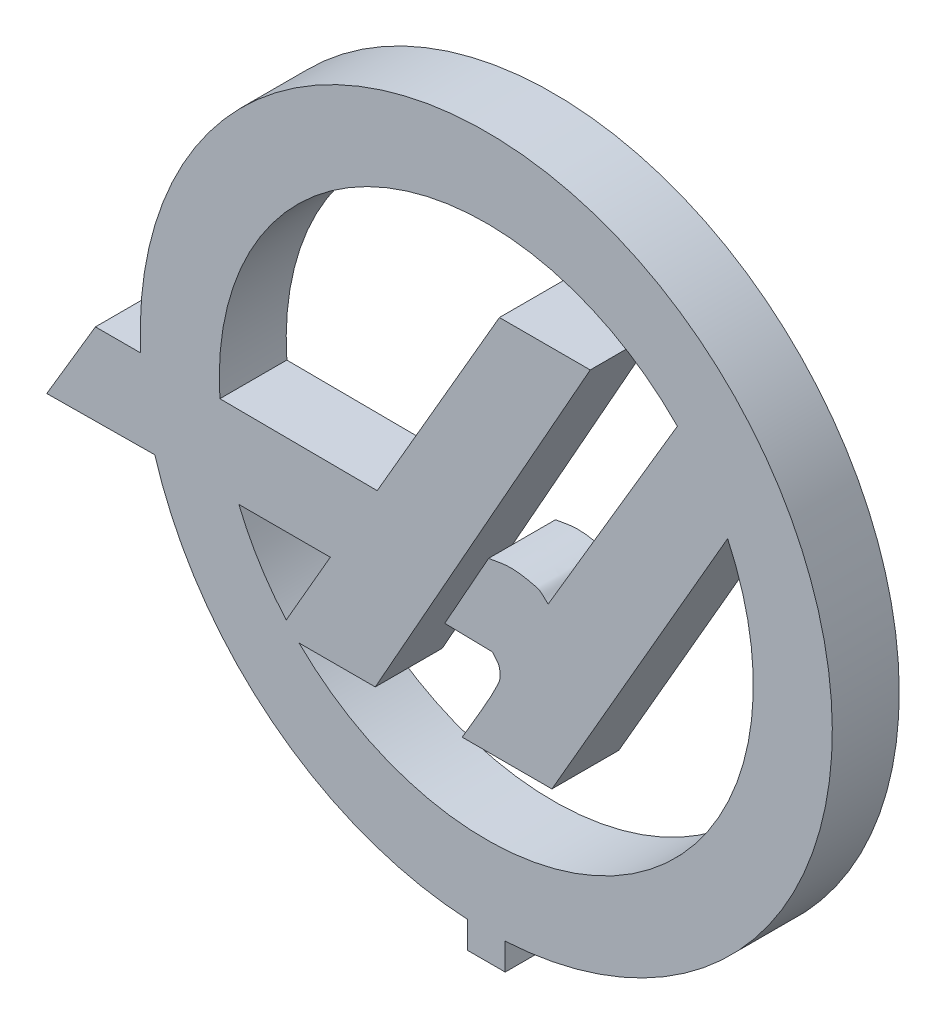
ISO-10303-21;
HEADER;
FILE_DESCRIPTION(('STEP AP214'),'2;1');
FILE_NAME('part.step','',(''),(''),'','','');
FILE_SCHEMA(('AUTOMOTIVE_DESIGN { 1 0 10303 214 1 1 1 1 }'));
ENDSEC;
DATA;
#1=APPLICATION_CONTEXT('core data for automotive mechanical design processes');
#2=APPLICATION_PROTOCOL_DEFINITION('international standard','automotive_design',2000,#1);
#3=PRODUCT_CONTEXT('',#1,'mechanical');
#4=PRODUCT('Part','Part','',(#3));
#5=PRODUCT_RELATED_PRODUCT_CATEGORY('part','',(#4));
#6=PRODUCT_DEFINITION_FORMATION('','',#4);
#7=PRODUCT_DEFINITION_CONTEXT('part definition',#1,'design');
#8=PRODUCT_DEFINITION('design','',#6,#7);
#9=PRODUCT_DEFINITION_SHAPE('','',#8);
#10=(LENGTH_UNIT() NAMED_UNIT(*) SI_UNIT(.MILLI.,.METRE.));
#11=(NAMED_UNIT(*) PLANE_ANGLE_UNIT() SI_UNIT($,.RADIAN.));
#12=(NAMED_UNIT(*) SI_UNIT($,.STERADIAN.) SOLID_ANGLE_UNIT());
#13=UNCERTAINTY_MEASURE_WITH_UNIT(LENGTH_MEASURE(1.E-05),#10,'distance_accuracy_value','');
#14=(GEOMETRIC_REPRESENTATION_CONTEXT(3) GLOBAL_UNCERTAINTY_ASSIGNED_CONTEXT((#13)) GLOBAL_UNIT_ASSIGNED_CONTEXT((#10,
#11,#12)) REPRESENTATION_CONTEXT('',''));
#15=CARTESIAN_POINT('',(0.,0.,0.));
#16=DIRECTION('',(0.,0.,1.));
#17=DIRECTION('',(1.,0.,0.));
#18=AXIS2_PLACEMENT_3D('',#15,#16,#17);
#19=CARTESIAN_POINT('',(429.057617760399,357.949109415741,35.6200474352115));
#20=DIRECTION('',(0.020467844201998,0.999790511734195,0.));
#21=DIRECTION('',(-0.999790511734195,0.020467844201998,0.));
#22=AXIS2_PLACEMENT_3D('',#19,#20,#21);
#23=PLANE('',#22);
#24=DIRECTION('',(0.999790511734195,-0.020467844201998,0.));
#25=VECTOR('',#24,1.);
#26=CARTESIAN_POINT('',(429.057617760399,357.949109415741,32.8800474352115));
#27=LINE('',#26,#25);
#28=CARTESIAN_POINT('',(445.39743278794,357.614598551367,32.8800474352115));
#29=VERTEX_POINT('',#28);
#30=CARTESIAN_POINT('',(447.351308345131,357.574598551342,32.8800474352115));
#31=VERTEX_POINT('',#30);
#32=EDGE_CURVE('E417',#29,#31,#27,.T.);
#33=ORIENTED_EDGE('',*,*,#32,.T.);
#34=DIRECTION('',(0.,0.,-1.));
#35=VECTOR('',#34,1.);
#36=CARTESIAN_POINT('',(447.351308345131,357.574598551342,35.6200474352115));
#37=LINE('',#36,#35);
#38=CARTESIAN_POINT('',(447.351308345131,357.574598551342,35.6200474352115));
#39=VERTEX_POINT('',#38);
#40=EDGE_CURVE('E11',#39,#31,#37,.T.);
#41=ORIENTED_EDGE('',*,*,#40,.F.);
#42=DIRECTION('',(0.999790511734195,-0.020467844201998,0.));
#43=VECTOR('',#42,1.);
#44=CARTESIAN_POINT('',(429.057617760399,357.949109415741,35.6200474352115));
#45=LINE('',#44,#43);
#46=CARTESIAN_POINT('',(445.39743278794,357.614598551367,35.6200474352115));
#47=VERTEX_POINT('',#46);
#48=EDGE_CURVE('E300',#47,#39,#45,.T.);
#49=ORIENTED_EDGE('',*,*,#48,.F.);
#50=DIRECTION('',(0.,0.,-1.));
#51=VECTOR('',#50,1.);
#52=CARTESIAN_POINT('',(445.39743278794,357.614598551367,35.6200474352115));
#53=LINE('',#52,#51);
#54=EDGE_CURVE('E358',#47,#29,#53,.T.);
#55=ORIENTED_EDGE('',*,*,#54,.T.);
#56=EDGE_LOOP('',(#33,#41,#49,#55));
#57=FACE_BOUND('',#56,.T.);
#58=ADVANCED_FACE('F35',(#57),#23,.F.);
#59=CARTESIAN_POINT('',(447.351308345131,357.574598551342,35.6200474352115));
#60=CARTESIAN_POINT('',(447.444641678464,357.441265218008,35.6200474352115));
#61=CARTESIAN_POINT('',(447.593325946149,357.332858547097,35.6200474352115));
#62=CARTESIAN_POINT('',(447.63130834513,357.174598551342,35.6200474352115));
#63=CARTESIAN_POINT('',(447.678086541947,356.979689397938,35.6200474352115));
#64=CARTESIAN_POINT('',(447.676440942673,356.756065403999,35.6200474352115));
#65=CARTESIAN_POINT('',(447.591308345131,356.574598551342,35.6200474352115));
#66=CARTESIAN_POINT('',(447.162829474532,355.661262011381,35.6200474352115));
#67=CARTESIAN_POINT('',(446.604641678464,354.814598551342,35.6200474352115));
#68=CARTESIAN_POINT('',(446.11130834513,353.934598551342,35.6200474352115));
#69=B_SPLINE_CURVE_WITH_KNOTS('',3,(#59,#60,#61,#62,#63,#64,#65,#66,#67,#68),.UNSPECIFIED.,.F.,
.F.,(4,3,3,4),(0.,1.,2.,3.),.UNSPECIFIED.);
#70=DIRECTION('',(0.,0.,-1.));
#71=VECTOR('',#70,1.);
#72=SURFACE_OF_LINEAR_EXTRUSION('',#69,#71);
#73=CARTESIAN_POINT('',(447.351308345131,357.574598551342,32.8800474352115));
#74=CARTESIAN_POINT('',(447.444641678464,357.441265218008,32.8800474352115));
#75=CARTESIAN_POINT('',(447.593325946149,357.332858547097,32.8800474352115));
#76=CARTESIAN_POINT('',(447.63130834513,357.174598551342,32.8800474352115));
#77=CARTESIAN_POINT('',(447.678086541947,356.979689397938,32.8800474352115));
#78=CARTESIAN_POINT('',(447.676440942673,356.756065403999,32.8800474352115));
#79=CARTESIAN_POINT('',(447.591308345131,356.574598551342,32.8800474352115));
#80=CARTESIAN_POINT('',(447.162829474532,355.661262011381,32.8800474352115));
#81=CARTESIAN_POINT('',(446.604641678464,354.814598551342,32.8800474352115));
#82=CARTESIAN_POINT('',(446.11130834513,353.934598551342,32.8800474352115));
#83=B_SPLINE_CURVE_WITH_KNOTS('',3,(#73,#74,#75,#76,#77,#78,#79,#80,#81,#82),.UNSPECIFIED.,.F.,
.F.,(4,3,3,4),(0.,1.,2.,3.),.UNSPECIFIED.);
#84=CARTESIAN_POINT('',(446.11130834513,353.934598551342,32.8800474352115));
#85=VERTEX_POINT('',#84);
#86=EDGE_CURVE('E420',#31,#85,#83,.T.);
#87=ORIENTED_EDGE('',*,*,#86,.T.);
#88=DIRECTION('',(0.,0.,-1.));
#89=VECTOR('',#88,1.);
#90=CARTESIAN_POINT('',(446.11130834513,353.934598551342,35.6200474352115));
#91=LINE('',#90,#89);
#92=CARTESIAN_POINT('',(446.11130834513,353.934598551342,35.6200474352115));
#93=VERTEX_POINT('',#92);
#94=EDGE_CURVE('E45',#93,#85,#91,.T.);
#95=ORIENTED_EDGE('',*,*,#94,.F.);
#96=EDGE_CURVE('E293',#39,#93,#69,.T.);
#97=ORIENTED_EDGE('',*,*,#96,.F.);
#98=ORIENTED_EDGE('',*,*,#40,.T.);
#99=EDGE_LOOP('',(#87,#95,#97,#98));
#100=FACE_BOUND('',#99,.T.);
#101=ADVANCED_FACE('F286',(#100),#72,.F.);
#102=CARTESIAN_POINT('',(428.83130834513,353.934598551342,35.6200474352115));
#103=DIRECTION('',(0.,1.,0.));
#104=DIRECTION('',(0.,0.,1.));
#105=AXIS2_PLACEMENT_3D('',#102,#103,#104);
#106=PLANE('',#105);
#107=DIRECTION('',(1.,0.,0.));
#108=VECTOR('',#107,1.);
#109=CARTESIAN_POINT('',(428.83130834513,353.934598551342,32.8800474352115));
#110=LINE('',#109,#108);
#111=CARTESIAN_POINT('',(449.7826573079,353.934598551342,32.8800474352115));
#112=VERTEX_POINT('',#111);
#113=EDGE_CURVE('E424',#85,#112,#110,.T.);
#114=ORIENTED_EDGE('',*,*,#113,.T.);
#115=DIRECTION('',(0.,0.,-1.));
#116=VECTOR('',#115,1.);
#117=CARTESIAN_POINT('',(449.7826573079,353.934598551342,35.6200474352115));
#118=LINE('',#117,#116);
#119=CARTESIAN_POINT('',(449.7826573079,353.934598551342,35.6200474352115));
#120=VERTEX_POINT('',#119);
#121=EDGE_CURVE('E346',#120,#112,#118,.T.);
#122=ORIENTED_EDGE('',*,*,#121,.F.);
#123=DIRECTION('',(1.,0.,0.));
#124=VECTOR('',#123,1.);
#125=CARTESIAN_POINT('',(428.83130834513,353.934598551342,35.6200474352115));
#126=LINE('',#125,#124);
#127=EDGE_CURVE('E299',#93,#120,#126,.T.);
#128=ORIENTED_EDGE('',*,*,#127,.F.);
#129=ORIENTED_EDGE('',*,*,#94,.T.);
#130=EDGE_LOOP('',(#114,#122,#128,#129));
#131=FACE_BOUND('',#130,.T.);
#132=ADVANCED_FACE('F282',(#131),#106,.F.);
#133=CARTESIAN_POINT('',(441.506148888732,339.584371200509,35.6200474352115));
#134=DIRECTION('',(-0.866250088911705,0.499610631852908,0.));
#135=DIRECTION('',(-0.499610631852908,-0.866250088911706,0.));
#136=AXIS2_PLACEMENT_3D('',#133,#134,#135);
#137=PLANE('',#136);
#138=DIRECTION('',(0.499610631852909,0.866250088911706,0.));
#139=VECTOR('',#138,1.);
#140=CARTESIAN_POINT('',(441.506148888732,339.584371200509,32.8800474352115));
#141=LINE('',#140,#139);
#142=CARTESIAN_POINT('',(456.975609721042,366.406101898485,32.8800474352115));
#143=VERTEX_POINT('',#142);
#144=EDGE_CURVE('E429',#112,#143,#141,.T.);
#145=ORIENTED_EDGE('',*,*,#144,.T.);
#146=DIRECTION('',(0.,0.,-1.));
#147=VECTOR('',#146,1.);
#148=CARTESIAN_POINT('',(456.975609721042,366.406101898485,35.6200474352115));
#149=LINE('',#148,#147);
#150=CARTESIAN_POINT('',(456.975609721042,366.406101898485,35.6200474352115));
#151=VERTEX_POINT('',#150);
#152=EDGE_CURVE('E344',#151,#143,#149,.T.);
#153=ORIENTED_EDGE('',*,*,#152,.F.);
#154=DIRECTION('',(0.499610631852909,0.866250088911706,0.));
#155=VECTOR('',#154,1.);
#156=CARTESIAN_POINT('',(441.506148888732,339.584371200509,35.6200474352115));
#157=LINE('',#156,#155);
#158=EDGE_CURVE('E306',#120,#151,#157,.T.);
#159=ORIENTED_EDGE('',*,*,#158,.F.);
#160=ORIENTED_EDGE('',*,*,#121,.T.);
#161=EDGE_LOOP('',(#145,#153,#159,#160));
#162=FACE_BOUND('',#161,.T.);
#163=ADVANCED_FACE('F278',(#162),#137,.F.);
#164=CARTESIAN_POINT('',(447.096669618877,361.72648814027,35.6200474352115));
#165=DIRECTION('',(0.,0.,-1.));
#166=DIRECTION('',(-1.,0.,0.));
#167=AXIS2_PLACEMENT_3D('',#164,#165,#166);
#168=CYLINDRICAL_SURFACE('',#167,10.9312507275352);
#169=CARTESIAN_POINT('',(447.096669618877,361.72648814027,32.8800474352115));
#170=DIRECTION('',(0.,0.,1.));
#171=DIRECTION('',(1.,0.,0.));
#172=AXIS2_PLACEMENT_3D('',#169,#170,#171);
#173=CIRCLE('',#172,10.9312507275352);
#174=CARTESIAN_POINT('',(439.431185568056,353.933376006158,32.8800474352115));
#175=VERTEX_POINT('',#174);
#176=EDGE_CURVE('E432',#175,#143,#173,.T.);
#177=ORIENTED_EDGE('',*,*,#176,.F.);
#178=DIRECTION('',(0.,0.,-1.));
#179=VECTOR('',#178,1.);
#180=CARTESIAN_POINT('',(439.431185568056,353.933376006158,35.6200474352115));
#181=LINE('',#180,#179);
#182=CARTESIAN_POINT('',(439.431185568056,353.933376006158,35.6200474352115));
#183=VERTEX_POINT('',#182);
#184=EDGE_CURVE('E342',#183,#175,#181,.T.);
#185=ORIENTED_EDGE('',*,*,#184,.F.);
#186=CARTESIAN_POINT('',(447.096669618877,361.72648814027,35.6200474352115));
#187=DIRECTION('',(0.,0.,1.));
#188=DIRECTION('',(1.,0.,0.));
#189=AXIS2_PLACEMENT_3D('',#186,#187,#188);
#190=CIRCLE('',#189,10.9312507275352);
#191=EDGE_CURVE('E308',#183,#151,#190,.T.);
#192=ORIENTED_EDGE('',*,*,#191,.T.);
#193=ORIENTED_EDGE('',*,*,#152,.T.);
#194=EDGE_LOOP('',(#177,#185,#192,#193));
#195=FACE_BOUND('',#194,.T.);
#196=ADVANCED_FACE('F274',(#195),#168,.F.);
#197=CARTESIAN_POINT('',(428.828551976002,353.929221587114,35.6200474352115));
#198=DIRECTION('',(-0.000391828944071524,0.999999923235036,0.));
#199=DIRECTION('',(-0.999999923235036,-0.000391828944071524,0.));
#200=AXIS2_PLACEMENT_3D('',#197,#198,#199);
#201=PLANE('',#200);
#202=DIRECTION('',(0.999999923235037,0.000391828944071524,0.));
#203=VECTOR('',#202,1.);
#204=CARTESIAN_POINT('',(428.828551976002,353.929221587114,32.8800474352115));
#205=LINE('',#204,#203);
#206=CARTESIAN_POINT('',(442.551284550626,353.934598551342,32.8800474352115));
#207=VERTEX_POINT('',#206);
#208=EDGE_CURVE('E435',#175,#207,#205,.T.);
#209=ORIENTED_EDGE('',*,*,#208,.T.);
#210=DIRECTION('',(0.,0.,-1.));
#211=VECTOR('',#210,1.);
#212=CARTESIAN_POINT('',(442.551284550626,353.934598551342,35.6200474352115));
#213=LINE('',#212,#211);
#214=CARTESIAN_POINT('',(442.551284550626,353.934598551342,35.6200474352115));
#215=VERTEX_POINT('',#214);
#216=EDGE_CURVE('E339',#215,#207,#213,.T.);
#217=ORIENTED_EDGE('',*,*,#216,.F.);
#218=DIRECTION('',(0.999999923235037,0.000391828944071524,0.));
#219=VECTOR('',#218,1.);
#220=CARTESIAN_POINT('',(428.828551976002,353.929221587114,35.6200474352115));
#221=LINE('',#220,#219);
#222=EDGE_CURVE('E311',#183,#215,#221,.T.);
#223=ORIENTED_EDGE('',*,*,#222,.F.);
#224=ORIENTED_EDGE('',*,*,#184,.T.);
#225=EDGE_LOOP('',(#209,#217,#223,#224));
#226=FACE_BOUND('',#225,.T.);
#227=ADVANCED_FACE('F270',(#226),#201,.F.);
#228=CARTESIAN_POINT('',(436.243529592178,342.724028005265,35.6200474352115));
#229=DIRECTION('',(-0.871515437445706,0.490368068183298,0.));
#230=DIRECTION('',(-0.490368068183298,-0.871515437445706,0.));
#231=AXIS2_PLACEMENT_3D('',#228,#229,#230);
#232=PLANE('',#231);
#233=DIRECTION('',(0.490368068183298,0.871515437445706,0.));
#234=VECTOR('',#233,1.);
#235=CARTESIAN_POINT('',(436.243529592178,342.724028005265,32.8800474352115));
#236=LINE('',#235,#234);
#237=CARTESIAN_POINT('',(451.351308344934,369.574598551835,32.8800474352115));
#238=VERTEX_POINT('',#237);
#239=EDGE_CURVE('E437',#207,#238,#236,.T.);
#240=ORIENTED_EDGE('',*,*,#239,.T.);
#241=DIRECTION('',(0.,0.,-1.));
#242=VECTOR('',#241,1.);
#243=CARTESIAN_POINT('',(451.351308344934,369.574598551835,35.6200474352115));
#244=LINE('',#243,#242);
#245=CARTESIAN_POINT('',(451.351308344934,369.574598551835,35.6200474352115));
#246=VERTEX_POINT('',#245);
#247=EDGE_CURVE('E336',#246,#238,#244,.T.);
#248=ORIENTED_EDGE('',*,*,#247,.F.);
#249=DIRECTION('',(0.490368068183298,0.871515437445706,0.));
#250=VECTOR('',#249,1.);
#251=CARTESIAN_POINT('',(436.243529592178,342.724028005265,35.6200474352115));
#252=LINE('',#251,#250);
#253=EDGE_CURVE('E313',#215,#246,#252,.T.);
#254=ORIENTED_EDGE('',*,*,#253,.F.);
#255=ORIENTED_EDGE('',*,*,#216,.T.);
#256=EDGE_LOOP('',(#240,#248,#254,#255));
#257=FACE_BOUND('',#256,.T.);
#258=ADVANCED_FACE('F266',(#257),#232,.F.);
#259=CARTESIAN_POINT('',(428.83130834513,369.574598551835,35.6200474352115));
#260=DIRECTION('',(0.,-1.,0.));
#261=DIRECTION('',(1.,0.,0.));
#262=AXIS2_PLACEMENT_3D('',#259,#260,#261);
#263=PLANE('',#262);
#264=DIRECTION('',(-1.,0.,0.));
#265=VECTOR('',#264,1.);
#266=CARTESIAN_POINT('',(428.83130834513,369.574598551835,32.8800474352115));
#267=LINE('',#266,#265);
#268=CARTESIAN_POINT('',(447.634538395417,369.574598551835,32.8800474352115));
#269=VERTEX_POINT('',#268);
#270=EDGE_CURVE('E439',#238,#269,#267,.T.);
#271=ORIENTED_EDGE('',*,*,#270,.T.);
#272=DIRECTION('',(0.,0.,-1.));
#273=VECTOR('',#272,1.);
#274=CARTESIAN_POINT('',(447.634538395417,369.574598551835,35.6200474352115));
#275=LINE('',#274,#273);
#276=CARTESIAN_POINT('',(447.634538395417,369.574598551835,35.6200474352115));
#277=VERTEX_POINT('',#276);
#278=EDGE_CURVE('E333',#277,#269,#275,.T.);
#279=ORIENTED_EDGE('',*,*,#278,.F.);
#280=DIRECTION('',(-1.,0.,0.));
#281=VECTOR('',#280,1.);
#282=CARTESIAN_POINT('',(428.83130834513,369.574598551835,35.6200474352115));
#283=LINE('',#282,#281);
#284=EDGE_CURVE('E315',#246,#277,#283,.T.);
#285=ORIENTED_EDGE('',*,*,#284,.F.);
#286=ORIENTED_EDGE('',*,*,#247,.T.);
#287=EDGE_LOOP('',(#271,#279,#285,#286));
#288=FACE_BOUND('',#287,.T.);
#289=ADVANCED_FACE('F262',(#288),#263,.F.);
#290=CARTESIAN_POINT('',(433.077260823107,344.435862783905,35.6200474352115));
#291=DIRECTION('',(0.865377431715627,-0.501120644832425,0.));
#292=DIRECTION('',(0.501120644832425,0.865377431715627,0.));
#293=AXIS2_PLACEMENT_3D('',#290,#291,#292);
#294=PLANE('',#293);
#295=DIRECTION('',(-0.501120644832425,-0.865377431715627,0.));
#296=VECTOR('',#295,1.);
#297=CARTESIAN_POINT('',(433.077260823107,344.435862783905,32.8800474352115));
#298=LINE('',#297,#296);
#299=CARTESIAN_POINT('',(442.631308344943,360.934598551817,32.8800474352115));
#300=VERTEX_POINT('',#299);
#301=EDGE_CURVE('E441',#269,#300,#298,.T.);
#302=ORIENTED_EDGE('',*,*,#301,.T.);
#303=DIRECTION('',(0.,0.,-1.));
#304=VECTOR('',#303,1.);
#305=CARTESIAN_POINT('',(442.631308344943,360.934598551817,35.6200474352115));
#306=LINE('',#305,#304);
#307=CARTESIAN_POINT('',(442.631308344943,360.934598551817,35.6200474352115));
#308=VERTEX_POINT('',#307);
#309=EDGE_CURVE('E327',#308,#300,#306,.T.);
#310=ORIENTED_EDGE('',*,*,#309,.F.);
#311=DIRECTION('',(-0.501120644832425,-0.865377431715627,0.));
#312=VECTOR('',#311,1.);
#313=CARTESIAN_POINT('',(433.077260823107,344.435862783905,35.6200474352115));
#314=LINE('',#313,#312);
#315=EDGE_CURVE('E317',#277,#308,#314,.T.);
#316=ORIENTED_EDGE('',*,*,#315,.F.);
#317=ORIENTED_EDGE('',*,*,#278,.T.);
#318=EDGE_LOOP('',(#302,#310,#316,#317));
#319=FACE_BOUND('',#318,.T.);
#320=ADVANCED_FACE('F258',(#319),#294,.F.);
#321=CARTESIAN_POINT('',(428.919042316277,361.019767906032,35.6200474352115));
#322=DIRECTION('',(-0.00621106031788096,-0.999980711178834,0.));
#323=DIRECTION('',(0.999980711178835,-0.00621106031788096,0.));
#324=AXIS2_PLACEMENT_3D('',#321,#322,#323);
#325=PLANE('',#324);
#326=DIRECTION('',(-0.999980711178835,0.00621106031788096,0.));
#327=VECTOR('',#326,1.);
#328=CARTESIAN_POINT('',(428.919042316277,361.019767906032,32.8800474352115));
#329=LINE('',#328,#327);
#330=CARTESIAN_POINT('',(436.191308344943,360.974598551817,32.8800474352115));
#331=VERTEX_POINT('',#330);
#332=EDGE_CURVE('E443',#300,#331,#329,.T.);
#333=ORIENTED_EDGE('',*,*,#332,.T.);
#334=DIRECTION('',(0.,0.,-1.));
#335=VECTOR('',#334,1.);
#336=CARTESIAN_POINT('',(436.191308344943,360.974598551817,35.6200474352115));
#337=LINE('',#336,#335);
#338=CARTESIAN_POINT('',(436.191308344943,360.974598551817,35.6200474352115));
#339=VERTEX_POINT('',#338);
#340=EDGE_CURVE('E322',#339,#331,#337,.T.);
#341=ORIENTED_EDGE('',*,*,#340,.F.);
#342=DIRECTION('',(-0.999980711178835,0.00621106031788096,0.));
#343=VECTOR('',#342,1.);
#344=CARTESIAN_POINT('',(428.919042316277,361.019767906032,35.6200474352115));
#345=LINE('',#344,#343);
#346=EDGE_CURVE('E319',#308,#339,#345,.T.);
#347=ORIENTED_EDGE('',*,*,#346,.F.);
#348=ORIENTED_EDGE('',*,*,#309,.T.);
#349=EDGE_LOOP('',(#333,#341,#347,#348));
#350=FACE_BOUND('',#349,.T.);
#351=ADVANCED_FACE('F254',(#350),#325,.F.);
#352=CARTESIAN_POINT('',(447.096669618877,361.72648814027,35.6200474352115));
#353=DIRECTION('',(0.,0.,-1.));
#354=DIRECTION('',(-1.,0.,0.));
#355=AXIS2_PLACEMENT_3D('',#352,#353,#354);
#356=CYLINDRICAL_SURFACE('',#355,10.9312507275352);
#357=CARTESIAN_POINT('',(447.096669618877,361.72648814027,32.8800474352115));
#358=DIRECTION('',(0.,0.,1.));
#359=DIRECTION('',(1.,0.,0.));
#360=AXIS2_PLACEMENT_3D('',#357,#358,#359);
#361=CIRCLE('',#360,10.9312507275352);
#362=CARTESIAN_POINT('',(454.918688584659,369.362472802852,32.8800474352115));
#363=VERTEX_POINT('',#362);
#364=EDGE_CURVE('E325',#363,#331,#361,.T.);
#365=ORIENTED_EDGE('',*,*,#364,.F.);
#366=DIRECTION('',(0.,0.,-1.));
#367=VECTOR('',#366,1.);
#368=CARTESIAN_POINT('',(454.918688584659,369.362472802852,35.6200474352115));
#369=LINE('',#368,#367);
#370=CARTESIAN_POINT('',(454.918688584659,369.362472802852,35.6200474352115));
#371=VERTEX_POINT('',#370);
#372=EDGE_CURVE('E227',#371,#363,#369,.T.);
#373=ORIENTED_EDGE('',*,*,#372,.F.);
#374=CARTESIAN_POINT('',(447.096669618877,361.72648814027,35.6200474352115));
#375=DIRECTION('',(0.,0.,1.));
#376=DIRECTION('',(1.,0.,0.));
#377=AXIS2_PLACEMENT_3D('',#374,#375,#376);
#378=CIRCLE('',#377,10.9312507275352);
#379=EDGE_CURVE('E220',#371,#339,#378,.T.);
#380=ORIENTED_EDGE('',*,*,#379,.T.);
#381=ORIENTED_EDGE('',*,*,#340,.T.);
#382=EDGE_LOOP('',(#365,#373,#380,#381));
#383=FACE_BOUND('',#382,.T.);
#384=ADVANCED_FACE('F251',(#383),#356,.F.);
#385=CARTESIAN_POINT('',(438.326683536555,341.283695029137,35.6200474352115));
#386=DIRECTION('',(0.860926528214315,-0.508729312126642,0.));
#387=DIRECTION('',(0.508729312126642,0.860926528214315,0.));
#388=AXIS2_PLACEMENT_3D('',#385,#386,#387);
#389=PLANE('',#388);
#390=DIRECTION('',(-0.508729312126642,-0.860926528214315,0.));
#391=VECTOR('',#390,1.);
#392=CARTESIAN_POINT('',(438.326683536555,341.283695029137,32.8800474352115));
#393=LINE('',#392,#391);
#394=CARTESIAN_POINT('',(449.631308345131,360.414598551342,32.8800474352115));
#395=VERTEX_POINT('',#394);
#396=EDGE_CURVE('E226',#363,#395,#393,.T.);
#397=ORIENTED_EDGE('',*,*,#396,.T.);
#398=DIRECTION('',(0.,0.,-1.));
#399=VECTOR('',#398,1.);
#400=CARTESIAN_POINT('',(449.631308345131,360.414598551342,35.6200474352115));
#401=LINE('',#400,#399);
#402=CARTESIAN_POINT('',(449.631308345131,360.414598551342,35.6200474352115));
#403=VERTEX_POINT('',#402);
#404=EDGE_CURVE('E223',#403,#395,#401,.T.);
#405=ORIENTED_EDGE('',*,*,#404,.F.);
#406=DIRECTION('',(-0.508729312126642,-0.860926528214315,0.));
#407=VECTOR('',#406,1.);
#408=CARTESIAN_POINT('',(438.326683536555,341.283695029137,35.6200474352115));
#409=LINE('',#408,#407);
#410=EDGE_CURVE('E214',#371,#403,#409,.T.);
#411=ORIENTED_EDGE('',*,*,#410,.F.);
#412=ORIENTED_EDGE('',*,*,#372,.T.);
#413=EDGE_LOOP('',(#397,#405,#411,#412));
#414=FACE_BOUND('',#413,.T.);
#415=ADVANCED_FACE('F224',(#414),#389,.F.);
#416=CARTESIAN_POINT('',(449.631308345131,360.414598551342,35.6200474352115));
#417=CARTESIAN_POINT('',(449.471308345131,360.534598551342,35.6200474352115));
#418=CARTESIAN_POINT('',(449.345567807457,360.727024805466,35.6200474352115));
#419=CARTESIAN_POINT('',(449.151308345131,360.774598551342,35.6200474352115));
#420=CARTESIAN_POINT('',(448.163075605006,361.016614732597,35.6200474352115));
#421=CARTESIAN_POINT('',(447.94537809051,360.940276842238,35.6200474352115));
#422=CARTESIAN_POINT('',(447.191308345131,360.814598551342,35.6200474352115));
#423=B_SPLINE_CURVE_WITH_KNOTS('',3,(#416,#417,#418,#419,#420,#421,#422),.UNSPECIFIED.,.F.,.F.,
(4,3,4),(0.,1.,2.),.UNSPECIFIED.);
#424=DIRECTION('',(0.,0.,-1.));
#425=VECTOR('',#424,1.);
#426=SURFACE_OF_LINEAR_EXTRUSION('',#423,#425);
#427=CARTESIAN_POINT('',(449.631308345131,360.414598551342,32.8800474352115));
#428=CARTESIAN_POINT('',(449.471308345131,360.534598551342,32.8800474352115));
#429=CARTESIAN_POINT('',(449.345567807457,360.727024805466,32.8800474352115));
#430=CARTESIAN_POINT('',(449.151308345131,360.774598551342,32.8800474352115));
#431=CARTESIAN_POINT('',(448.163075605006,361.016614732597,32.8800474352115));
#432=CARTESIAN_POINT('',(447.94537809051,360.940276842238,32.8800474352115));
#433=CARTESIAN_POINT('',(447.191308345131,360.814598551342,32.8800474352115));
#434=B_SPLINE_CURVE_WITH_KNOTS('',3,(#427,#428,#429,#430,#431,#432,#433),.UNSPECIFIED.,.F.,.F.,
(4,3,4),(0.,1.,2.),.UNSPECIFIED.);
#435=CARTESIAN_POINT('',(447.191308345131,360.814598551342,32.8800474352115));
#436=VERTEX_POINT('',#435);
#437=EDGE_CURVE('E134',#395,#436,#434,.T.);
#438=ORIENTED_EDGE('',*,*,#437,.T.);
#439=DIRECTION('',(0.,0.,-1.));
#440=VECTOR('',#439,1.);
#441=CARTESIAN_POINT('',(447.191308345131,360.814598551342,35.6200474352115));
#442=LINE('',#441,#440);
#443=CARTESIAN_POINT('',(447.191308345131,360.814598551342,35.6200474352115));
#444=VERTEX_POINT('',#443);
#445=EDGE_CURVE('E228',#444,#436,#442,.T.);
#446=ORIENTED_EDGE('',*,*,#445,.F.);
#447=EDGE_CURVE('E218',#403,#444,#423,.T.);
#448=ORIENTED_EDGE('',*,*,#447,.F.);
#449=ORIENTED_EDGE('',*,*,#404,.T.);
#450=EDGE_LOOP('',(#438,#446,#448,#449));
#451=FACE_BOUND('',#450,.T.);
#452=ADVANCED_FACE('F230',(#451),#426,.F.);
#453=CARTESIAN_POINT('',(447.096669618877,361.72648814027,35.6200474352115));
#454=DIRECTION('',(0.,0.,-1.));
#455=DIRECTION('',(-1.,0.,0.));
#456=AXIS2_PLACEMENT_3D('',#453,#454,#455);
#457=CYLINDRICAL_SURFACE('',#456,10.9312507275352);
#458=CARTESIAN_POINT('',(447.096669618877,361.72648814027,32.8800474352115));
#459=DIRECTION('',(0.,0.,1.));
#460=DIRECTION('',(1.,0.,0.));
#461=AXIS2_PLACEMENT_3D('',#458,#459,#460);
#462=CIRCLE('',#461,10.9312507275352);
#463=CARTESIAN_POINT('',(436.968263699044,357.614598551367,32.8800474352115));
#464=VERTEX_POINT('',#463);
#465=CARTESIAN_POINT('',(438.906680338388,354.486576673013,32.8800474352115));
#466=VERTEX_POINT('',#465);
#467=EDGE_CURVE('E408',#464,#466,#462,.T.);
#468=ORIENTED_EDGE('',*,*,#467,.F.);
#469=DIRECTION('',(0.,0.,-1.));
#470=VECTOR('',#469,1.);
#471=CARTESIAN_POINT('',(436.968263699044,357.614598551367,35.6200474352115));
#472=LINE('',#471,#470);
#473=CARTESIAN_POINT('',(436.968263699044,357.614598551367,35.6200474352115));
#474=VERTEX_POINT('',#473);
#475=EDGE_CURVE('E356',#474,#464,#472,.T.);
#476=ORIENTED_EDGE('',*,*,#475,.F.);
#477=CARTESIAN_POINT('',(447.096669618877,361.72648814027,35.6200474352115));
#478=DIRECTION('',(0.,0.,1.));
#479=DIRECTION('',(1.,0.,0.));
#480=AXIS2_PLACEMENT_3D('',#477,#478,#479);
#481=CIRCLE('',#480,10.9312507275352);
#482=CARTESIAN_POINT('',(438.906680338388,354.486576673013,35.6200474352115));
#483=VERTEX_POINT('',#482);
#484=EDGE_CURVE('E467',#474,#483,#481,.T.);
#485=ORIENTED_EDGE('',*,*,#484,.T.);
#486=DIRECTION('',(0.,0.,-1.));
#487=VECTOR('',#486,1.);
#488=CARTESIAN_POINT('',(438.906680338388,354.486576673013,35.6200474352115));
#489=LINE('',#488,#487);
#490=EDGE_CURVE('E351',#483,#466,#489,.T.);
#491=ORIENTED_EDGE('',*,*,#490,.T.);
#492=EDGE_LOOP('',(#468,#476,#485,#491));
#493=FACE_BOUND('',#492,.T.);
#494=ADVANCED_FACE('F246',(#493),#457,.F.);
#495=CARTESIAN_POINT('',(428.83130834513,357.614598551367,35.6200474352115));
#496=DIRECTION('',(0.,1.,0.));
#497=DIRECTION('',(0.,0.,1.));
#498=AXIS2_PLACEMENT_3D('',#495,#496,#497);
#499=PLANE('',#498);
#500=DIRECTION('',(1.,0.,0.));
#501=VECTOR('',#500,1.);
#502=CARTESIAN_POINT('',(428.83130834513,357.614598551367,32.8800474352115));
#503=LINE('',#502,#501);
#504=CARTESIAN_POINT('',(440.711308345131,357.614598551367,32.8800474352115));
#505=VERTEX_POINT('',#504);
#506=EDGE_CURVE('E411',#464,#505,#503,.T.);
#507=ORIENTED_EDGE('',*,*,#506,.T.);
#508=DIRECTION('',(0.,0.,-1.));
#509=VECTOR('',#508,1.);
#510=CARTESIAN_POINT('',(440.711308345131,357.614598551367,35.6200474352115));
#511=LINE('',#510,#509);
#512=CARTESIAN_POINT('',(440.711308345131,357.614598551367,35.6200474352115));
#513=VERTEX_POINT('',#512);
#514=EDGE_CURVE('E353',#513,#505,#511,.T.);
#515=ORIENTED_EDGE('',*,*,#514,.F.);
#516=DIRECTION('',(1.,0.,0.));
#517=VECTOR('',#516,1.);
#518=CARTESIAN_POINT('',(428.83130834513,357.614598551367,35.6200474352115));
#519=LINE('',#518,#517);
#520=EDGE_CURVE('E462',#474,#513,#519,.T.);
#521=ORIENTED_EDGE('',*,*,#520,.F.);
#522=ORIENTED_EDGE('',*,*,#475,.T.);
#523=EDGE_LOOP('',(#507,#515,#521,#522));
#524=FACE_BOUND('',#523,.T.);
#525=ADVANCED_FACE('F576',(#524),#499,.F.);
#526=CARTESIAN_POINT('',(428.737264129586,357.611384145986,35.6200474352115));
#527=DIRECTION('',(0.00877507475080324,-0.999961498290368,0.));
#528=DIRECTION('',(0.999961498290368,0.00877507475080324,0.));
#529=AXIS2_PLACEMENT_3D('',#526,#527,#528);
#530=PLANE('',#529);
#531=DIRECTION('',(-0.999961498290368,-0.00877507475080324,0.));
#532=VECTOR('',#531,1.);
#533=CARTESIAN_POINT('',(428.737264129586,357.611384145986,32.8800474352115));
#534=LINE('',#533,#532);
#535=CARTESIAN_POINT('',(433.529545778872,357.653438394845,32.8800474352115));
#536=VERTEX_POINT('',#535);
#537=CARTESIAN_POINT('',(429.103560909094,357.614598551367,32.8800474352115));
#538=VERTEX_POINT('',#537);
#539=EDGE_CURVE('E390',#536,#538,#534,.T.);
#540=ORIENTED_EDGE('',*,*,#539,.F.);
#541=DIRECTION('',(0.,0.,-1.));
#542=VECTOR('',#541,1.);
#543=CARTESIAN_POINT('',(433.529545778872,357.653438394845,35.6200474352115));
#544=LINE('',#543,#542);
#545=CARTESIAN_POINT('',(433.529545778872,357.653438394845,35.6200474352115));
#546=VERTEX_POINT('',#545);
#547=EDGE_CURVE('E39',#546,#536,#544,.T.);
#548=ORIENTED_EDGE('',*,*,#547,.F.);
#549=DIRECTION('',(-0.999961498290368,-0.00877507475080324,0.));
#550=VECTOR('',#549,1.);
#551=CARTESIAN_POINT('',(428.737264129586,357.611384145986,35.6200474352115));
#552=LINE('',#551,#550);
#553=CARTESIAN_POINT('',(429.103560909094,357.614598551367,35.6200474352115));
#554=VERTEX_POINT('',#553);
#555=EDGE_CURVE('E454',#546,#554,#552,.T.);
#556=ORIENTED_EDGE('',*,*,#555,.T.);
#557=DIRECTION('',(0.,0.,-1.));
#558=VECTOR('',#557,1.);
#559=CARTESIAN_POINT('',(429.103560909094,357.614598551367,35.6200474352115));
#560=LINE('',#559,#558);
#561=EDGE_CURVE('E232',#554,#538,#560,.T.);
#562=ORIENTED_EDGE('',*,*,#561,.T.);
#563=EDGE_LOOP('',(#540,#548,#556,#562));
#564=FACE_BOUND('',#563,.T.);
#565=ADVANCED_FACE('F37',(#564),#530,.T.);
#566=CARTESIAN_POINT('',(447.096669618877,361.72648814027,35.6200474352115));
#567=DIRECTION('',(0.,0.,-1.));
#568=DIRECTION('',(-1.,0.,0.));
#569=AXIS2_PLACEMENT_3D('',#566,#567,#568);
#570=CYLINDRICAL_SURFACE('',#569,14.1653303356731);
#571=CARTESIAN_POINT('',(447.096669618877,361.72648814027,32.8800474352115));
#572=DIRECTION('',(0.,0.,1.));
#573=DIRECTION('',(1.,0.,0.));
#574=AXIS2_PLACEMENT_3D('',#571,#572,#573);
#575=CIRCLE('',#574,14.1653303356731);
#576=CARTESIAN_POINT('',(446.321669618877,347.582374222504,32.8800474352115));
#577=VERTEX_POINT('',#576);
#578=EDGE_CURVE('E381',#536,#577,#575,.T.);
#579=ORIENTED_EDGE('',*,*,#578,.T.);
#580=DIRECTION('',(0.,0.,-1.));
#581=VECTOR('',#580,1.);
#582=CARTESIAN_POINT('',(446.321669618877,347.582374222504,35.6200474352115));
#583=LINE('',#582,#581);
#584=CARTESIAN_POINT('',(446.321669618877,347.582374222504,35.6200474352115));
#585=VERTEX_POINT('',#584);
#586=EDGE_CURVE('E372',#585,#577,#583,.T.);
#587=ORIENTED_EDGE('',*,*,#586,.F.);
#588=CARTESIAN_POINT('',(447.096669618877,361.72648814027,35.6200474352115));
#589=DIRECTION('',(0.,0.,1.));
#590=DIRECTION('',(1.,0.,0.));
#591=AXIS2_PLACEMENT_3D('',#588,#589,#590);
#592=CIRCLE('',#591,14.1653303356731);
#593=EDGE_CURVE('E383',#546,#585,#592,.T.);
#594=ORIENTED_EDGE('',*,*,#593,.F.);
#595=ORIENTED_EDGE('',*,*,#547,.T.);
#596=EDGE_LOOP('',(#579,#587,#594,#595));
#597=FACE_BOUND('',#596,.T.);
#598=ADVANCED_FACE('F380',(#597),#570,.T.);
#599=CARTESIAN_POINT('',(446.321669618877,346.894598551342,35.6200474352115));
#600=DIRECTION('',(-1.,0.,0.));
#601=DIRECTION('',(0.,0.,1.));
#602=AXIS2_PLACEMENT_3D('',#599,#600,#601);
#603=PLANE('',#602);
#604=DIRECTION('',(0.,1.,0.));
#605=VECTOR('',#604,1.);
#606=CARTESIAN_POINT('',(446.321669618877,346.894598551342,32.8800474352115));
#607=LINE('',#606,#605);
#608=CARTESIAN_POINT('',(446.321669618877,346.485671773398,32.8800474352115));
#609=VERTEX_POINT('',#608);
#610=EDGE_CURVE('E393',#609,#577,#607,.T.);
#611=ORIENTED_EDGE('',*,*,#610,.F.);
#612=DIRECTION('',(0.,0.,-1.));
#613=VECTOR('',#612,1.);
#614=CARTESIAN_POINT('',(446.321669618877,346.485671773398,35.6200474352115));
#615=LINE('',#614,#613);
#616=CARTESIAN_POINT('',(446.321669618877,346.485671773398,35.6200474352115));
#617=VERTEX_POINT('',#616);
#618=EDGE_CURVE('E371',#617,#609,#615,.T.);
#619=ORIENTED_EDGE('',*,*,#618,.F.);
#620=DIRECTION('',(0.,1.,0.));
#621=VECTOR('',#620,1.);
#622=CARTESIAN_POINT('',(446.321669618877,346.894598551342,35.6200474352115));
#623=LINE('',#622,#621);
#624=EDGE_CURVE('E483',#617,#585,#623,.T.);
#625=ORIENTED_EDGE('',*,*,#624,.T.);
#626=ORIENTED_EDGE('',*,*,#586,.T.);
#627=EDGE_LOOP('',(#611,#619,#625,#626));
#628=FACE_BOUND('',#627,.T.);
#629=ADVANCED_FACE('F507',(#628),#603,.T.);
#630=CARTESIAN_POINT('',(428.83130834513,346.485671773398,35.6200474352115));
#631=DIRECTION('',(0.,1.,0.));
#632=DIRECTION('',(-1.,0.,0.));
#633=AXIS2_PLACEMENT_3D('',#630,#631,#632);
#634=PLANE('',#633);
#635=DIRECTION('',(1.,0.,0.));
#636=VECTOR('',#635,1.);
#637=CARTESIAN_POINT('',(428.83130834513,346.485671773398,32.8800474352115));
#638=LINE('',#637,#636);
#639=CARTESIAN_POINT('',(447.871669618877,346.485671773398,32.8800474352115));
#640=VERTEX_POINT('',#639);
#641=EDGE_CURVE('E397',#609,#640,#638,.T.);
#642=ORIENTED_EDGE('',*,*,#641,.T.);
#643=DIRECTION('',(0.,0.,-1.));
#644=VECTOR('',#643,1.);
#645=CARTESIAN_POINT('',(447.871669618877,346.485671773398,35.6200474352115));
#646=LINE('',#645,#644);
#647=CARTESIAN_POINT('',(447.871669618877,346.485671773398,35.6200474352115));
#648=VERTEX_POINT('',#647);
#649=EDGE_CURVE('E368',#648,#640,#646,.T.);
#650=ORIENTED_EDGE('',*,*,#649,.F.);
#651=DIRECTION('',(1.,0.,0.));
#652=VECTOR('',#651,1.);
#653=CARTESIAN_POINT('',(428.83130834513,346.485671773398,35.6200474352115));
#654=LINE('',#653,#652);
#655=EDGE_CURVE('E481',#617,#648,#654,.T.);
#656=ORIENTED_EDGE('',*,*,#655,.F.);
#657=ORIENTED_EDGE('',*,*,#618,.T.);
#658=EDGE_LOOP('',(#642,#650,#656,#657));
#659=FACE_BOUND('',#658,.T.);
#660=ADVANCED_FACE('F510',(#659),#634,.F.);
#661=CARTESIAN_POINT('',(447.871669618877,346.894598551342,35.6200474352115));
#662=DIRECTION('',(-1.,0.,0.));
#663=DIRECTION('',(0.,0.,1.));
#664=AXIS2_PLACEMENT_3D('',#661,#662,#663);
#665=PLANE('',#664);
#666=DIRECTION('',(0.,1.,0.));
#667=VECTOR('',#666,1.);
#668=CARTESIAN_POINT('',(447.871669618877,346.894598551342,32.8800474352115));
#669=LINE('',#668,#667);
#670=CARTESIAN_POINT('',(447.871669618877,347.582374222504,32.8800474352115));
#671=VERTEX_POINT('',#670);
#672=EDGE_CURVE('E399',#640,#671,#669,.T.);
#673=ORIENTED_EDGE('',*,*,#672,.T.);
#674=DIRECTION('',(0.,0.,-1.));
#675=VECTOR('',#674,1.);
#676=CARTESIAN_POINT('',(447.871669618877,347.582374222504,35.6200474352115));
#677=LINE('',#676,#675);
#678=CARTESIAN_POINT('',(447.871669618877,347.582374222504,35.6200474352115));
#679=VERTEX_POINT('',#678);
#680=EDGE_CURVE('E365',#679,#671,#677,.T.);
#681=ORIENTED_EDGE('',*,*,#680,.F.);
#682=DIRECTION('',(0.,1.,0.));
#683=VECTOR('',#682,1.);
#684=CARTESIAN_POINT('',(447.871669618877,346.894598551342,35.6200474352115));
#685=LINE('',#684,#683);
#686=EDGE_CURVE('E479',#648,#679,#685,.T.);
#687=ORIENTED_EDGE('',*,*,#686,.F.);
#688=ORIENTED_EDGE('',*,*,#649,.T.);
#689=EDGE_LOOP('',(#673,#681,#687,#688));
#690=FACE_BOUND('',#689,.T.);
#691=ADVANCED_FACE('F504',(#690),#665,.F.);
#692=CARTESIAN_POINT('',(447.096669618877,361.72648814027,35.6200474352115));
#693=DIRECTION('',(0.,0.,-1.));
#694=DIRECTION('',(-1.,0.,0.));
#695=AXIS2_PLACEMENT_3D('',#692,#693,#694);
#696=CYLINDRICAL_SURFACE('',#695,14.1653303356731);
#697=CARTESIAN_POINT('',(447.096669618877,361.72648814027,32.8800474352115));
#698=DIRECTION('',(0.,0.,1.));
#699=DIRECTION('',(1.,0.,0.));
#700=AXIS2_PLACEMENT_3D('',#697,#698,#699);
#701=CIRCLE('',#700,14.1653303356731);
#702=CARTESIAN_POINT('',(432.95130834513,360.974598551344,32.8800474352115));
#703=VERTEX_POINT('',#702);
#704=EDGE_CURVE('E401',#671,#703,#701,.T.);
#705=ORIENTED_EDGE('',*,*,#704,.T.);
#706=DIRECTION('',(0.,0.,-1.));
#707=VECTOR('',#706,1.);
#708=CARTESIAN_POINT('',(432.95130834513,360.974598551344,35.6200474352115));
#709=LINE('',#708,#707);
#710=CARTESIAN_POINT('',(432.95130834513,360.974598551344,35.6200474352115));
#711=VERTEX_POINT('',#710);
#712=EDGE_CURVE('E362',#711,#703,#709,.T.);
#713=ORIENTED_EDGE('',*,*,#712,.F.);
#714=CARTESIAN_POINT('',(447.096669618877,361.72648814027,35.6200474352115));
#715=DIRECTION('',(0.,0.,1.));
#716=DIRECTION('',(1.,0.,0.));
#717=AXIS2_PLACEMENT_3D('',#714,#715,#716);
#718=CIRCLE('',#717,14.1653303356731);
#719=EDGE_CURVE('E477',#679,#711,#718,.T.);
#720=ORIENTED_EDGE('',*,*,#719,.F.);
#721=ORIENTED_EDGE('',*,*,#680,.T.);
#722=EDGE_LOOP('',(#705,#713,#720,#721));
#723=FACE_BOUND('',#722,.T.);
#724=ADVANCED_FACE('F500',(#723),#696,.T.);
#725=CARTESIAN_POINT('',(428.83130834513,360.974598551344,35.6200474352115));
#726=DIRECTION('',(0.,-1.,0.));
#727=DIRECTION('',(0.,0.,-1.));
#728=AXIS2_PLACEMENT_3D('',#725,#726,#727);
#729=PLANE('',#728);
#730=DIRECTION('',(-1.,0.,0.));
#731=VECTOR('',#730,1.);
#732=CARTESIAN_POINT('',(428.83130834513,360.974598551344,32.8800474352115));
#733=LINE('',#732,#731);
#734=CARTESIAN_POINT('',(431.096930260303,360.974598551344,32.8800474352115));
#735=VERTEX_POINT('',#734);
#736=EDGE_CURVE('E403',#703,#735,#733,.T.);
#737=ORIENTED_EDGE('',*,*,#736,.T.);
#738=DIRECTION('',(0.,0.,-1.));
#739=VECTOR('',#738,1.);
#740=CARTESIAN_POINT('',(431.096930260303,360.974598551344,35.6200474352115));
#741=LINE('',#740,#739);
#742=CARTESIAN_POINT('',(431.096930260303,360.974598551344,35.6200474352115));
#743=VERTEX_POINT('',#742);
#744=EDGE_CURVE('E360',#743,#735,#741,.T.);
#745=ORIENTED_EDGE('',*,*,#744,.F.);
#746=DIRECTION('',(-1.,0.,0.));
#747=VECTOR('',#746,1.);
#748=CARTESIAN_POINT('',(428.83130834513,360.974598551344,35.6200474352115));
#749=LINE('',#748,#747);
#750=EDGE_CURVE('E475',#711,#743,#749,.T.);
#751=ORIENTED_EDGE('',*,*,#750,.F.);
#752=ORIENTED_EDGE('',*,*,#712,.T.);
#753=EDGE_LOOP('',(#737,#745,#751,#752));
#754=FACE_BOUND('',#753,.T.);
#755=ADVANCED_FACE('F496',(#754),#729,.F.);
#756=CARTESIAN_POINT('',(433.104427102057,344.429337730038,35.6200474352115));
#757=DIRECTION('',(0.866185586048601,-0.499722453489577,0.));
#758=DIRECTION('',(0.499722453489577,0.866185586048601,0.));
#759=AXIS2_PLACEMENT_3D('',#756,#757,#758);
#760=PLANE('',#759);
#761=DIRECTION('',(-0.499722453489577,-0.866185586048601,0.));
#762=VECTOR('',#761,1.);
#763=CARTESIAN_POINT('',(433.104427102057,344.429337730038,32.8800474352115));
#764=LINE('',#763,#762);
#765=EDGE_CURVE('E414',#505,#466,#764,.T.);
#766=ORIENTED_EDGE('',*,*,#765,.T.);
#767=ORIENTED_EDGE('',*,*,#490,.F.);
#768=DIRECTION('',(-0.499722453489577,-0.866185586048601,0.));
#769=VECTOR('',#768,1.);
#770=CARTESIAN_POINT('',(433.104427102057,344.429337730038,35.6200474352115));
#771=LINE('',#770,#769);
#772=EDGE_CURVE('E461',#513,#483,#771,.T.);
#773=ORIENTED_EDGE('',*,*,#772,.F.);
#774=ORIENTED_EDGE('',*,*,#514,.T.);
#775=EDGE_LOOP('',(#766,#767,#773,#774));
#776=FACE_BOUND('',#775,.T.);
#777=ADVANCED_FACE('F626',(#776),#760,.F.);
#778=CARTESIAN_POINT('',(424.328563125341,349.565918288691,35.6200474352115));
#779=DIRECTION('',(-0.860037916766267,0.510230126241424,0.));
#780=DIRECTION('',(-0.510230126241424,-0.860037916766267,0.));
#781=AXIS2_PLACEMENT_3D('',#778,#779,#780);
#782=PLANE('',#781);
#783=DIRECTION('',(0.510230126241424,0.860037916766267,0.));
#784=VECTOR('',#783,1.);
#785=CARTESIAN_POINT('',(424.328563125341,349.565918288691,32.8800474352115));
#786=LINE('',#785,#784);
#787=EDGE_CURVE('E406',#538,#735,#786,.T.);
#788=ORIENTED_EDGE('',*,*,#787,.F.);
#789=ORIENTED_EDGE('',*,*,#561,.F.);
#790=DIRECTION('',(0.510230126241424,0.860037916766267,0.));
#791=VECTOR('',#790,1.);
#792=CARTESIAN_POINT('',(424.328563125341,349.565918288691,35.6200474352115));
#793=LINE('',#792,#791);
#794=EDGE_CURVE('E472',#554,#743,#793,.T.);
#795=ORIENTED_EDGE('',*,*,#794,.T.);
#796=ORIENTED_EDGE('',*,*,#744,.T.);
#797=EDGE_LOOP('',(#788,#789,#795,#796));
#798=FACE_BOUND('',#797,.T.);
#799=ADVANCED_FACE('F491',(#798),#782,.T.);
#800=CARTESIAN_POINT('',(436.863712223995,342.391744493876,35.6200474352115));
#801=DIRECTION('',(0.872287975009376,-0.488992524128992,0.));
#802=DIRECTION('',(0.488992524128992,0.872287975009376,0.));
#803=AXIS2_PLACEMENT_3D('',#800,#801,#802);
#804=PLANE('',#803);
#805=DIRECTION('',(-0.488992524128992,-0.872287975009376,0.));
#806=VECTOR('',#805,1.);
#807=CARTESIAN_POINT('',(436.863712223995,342.391744493876,32.8800474352115));
#808=LINE('',#807,#806);
#809=EDGE_CURVE('E140',#436,#29,#808,.T.);
#810=ORIENTED_EDGE('',*,*,#809,.T.);
#811=ORIENTED_EDGE('',*,*,#54,.F.);
#812=DIRECTION('',(-0.488992524128992,-0.872287975009376,0.));
#813=VECTOR('',#812,1.);
#814=CARTESIAN_POINT('',(436.863712223995,342.391744493876,35.6200474352115));
#815=LINE('',#814,#813);
#816=EDGE_CURVE('E54',#444,#47,#815,.T.);
#817=ORIENTED_EDGE('',*,*,#816,.F.);
#818=ORIENTED_EDGE('',*,*,#445,.T.);
#819=EDGE_LOOP('',(#810,#811,#817,#818));
#820=FACE_BOUND('',#819,.T.);
#821=ADVANCED_FACE('F247',(#820),#804,.F.);
#822=CARTESIAN_POINT('',(428.83130834513,346.894598551342,35.6200474352115));
#823=DIRECTION('',(0.,0.,1.));
#824=DIRECTION('',(1.,0.,0.));
#825=AXIS2_PLACEMENT_3D('',#822,#823,#824);
#826=PLANE('',#825);
#827=ORIENTED_EDGE('',*,*,#555,.F.);
#828=ORIENTED_EDGE('',*,*,#593,.T.);
#829=ORIENTED_EDGE('',*,*,#624,.F.);
#830=ORIENTED_EDGE('',*,*,#655,.T.);
#831=ORIENTED_EDGE('',*,*,#686,.T.);
#832=ORIENTED_EDGE('',*,*,#719,.T.);
#833=ORIENTED_EDGE('',*,*,#750,.T.);
#834=ORIENTED_EDGE('',*,*,#794,.F.);
#835=EDGE_LOOP('',(#827,#828,#829,#830,#831,#832,#833,#834));
#836=FACE_BOUND('',#835,.T.);
#837=ORIENTED_EDGE('',*,*,#484,.F.);
#838=ORIENTED_EDGE('',*,*,#520,.T.);
#839=ORIENTED_EDGE('',*,*,#772,.T.);
#840=EDGE_LOOP('',(#837,#838,#839));
#841=FACE_BOUND('',#840,.T.);
#842=ORIENTED_EDGE('',*,*,#48,.T.);
#843=ORIENTED_EDGE('',*,*,#96,.T.);
#844=ORIENTED_EDGE('',*,*,#127,.T.);
#845=ORIENTED_EDGE('',*,*,#158,.T.);
#846=ORIENTED_EDGE('',*,*,#191,.F.);
#847=ORIENTED_EDGE('',*,*,#222,.T.);
#848=ORIENTED_EDGE('',*,*,#253,.T.);
#849=ORIENTED_EDGE('',*,*,#284,.T.);
#850=ORIENTED_EDGE('',*,*,#315,.T.);
#851=ORIENTED_EDGE('',*,*,#346,.T.);
#852=ORIENTED_EDGE('',*,*,#379,.F.);
#853=ORIENTED_EDGE('',*,*,#410,.T.);
#854=ORIENTED_EDGE('',*,*,#447,.T.);
#855=ORIENTED_EDGE('',*,*,#816,.T.);
#856=EDGE_LOOP('',(#842,#843,#844,#845,#846,#847,#848,#849,#850,#851,#852,#853,#854,#855));
#857=FACE_BOUND('',#856,.T.);
#858=ADVANCED_FACE('F216',(#836,#841,#857),#826,.T.);
#859=CARTESIAN_POINT('',(428.83130834513,346.894598551342,32.8800474352115));
#860=DIRECTION('',(0.,0.,1.));
#861=DIRECTION('',(1.,0.,0.));
#862=AXIS2_PLACEMENT_3D('',#859,#860,#861);
#863=PLANE('',#862);
#864=ORIENTED_EDGE('',*,*,#539,.T.);
#865=ORIENTED_EDGE('',*,*,#787,.T.);
#866=ORIENTED_EDGE('',*,*,#736,.F.);
#867=ORIENTED_EDGE('',*,*,#704,.F.);
#868=ORIENTED_EDGE('',*,*,#672,.F.);
#869=ORIENTED_EDGE('',*,*,#641,.F.);
#870=ORIENTED_EDGE('',*,*,#610,.T.);
#871=ORIENTED_EDGE('',*,*,#578,.F.);
#872=EDGE_LOOP('',(#864,#865,#866,#867,#868,#869,#870,#871));
#873=FACE_BOUND('',#872,.T.);
#874=ORIENTED_EDGE('',*,*,#467,.T.);
#875=ORIENTED_EDGE('',*,*,#765,.F.);
#876=ORIENTED_EDGE('',*,*,#506,.F.);
#877=EDGE_LOOP('',(#874,#875,#876));
#878=FACE_BOUND('',#877,.T.);
#879=ORIENTED_EDGE('',*,*,#32,.F.);
#880=ORIENTED_EDGE('',*,*,#809,.F.);
#881=ORIENTED_EDGE('',*,*,#437,.F.);
#882=ORIENTED_EDGE('',*,*,#396,.F.);
#883=ORIENTED_EDGE('',*,*,#364,.T.);
#884=ORIENTED_EDGE('',*,*,#332,.F.);
#885=ORIENTED_EDGE('',*,*,#301,.F.);
#886=ORIENTED_EDGE('',*,*,#270,.F.);
#887=ORIENTED_EDGE('',*,*,#239,.F.);
#888=ORIENTED_EDGE('',*,*,#208,.F.);
#889=ORIENTED_EDGE('',*,*,#176,.T.);
#890=ORIENTED_EDGE('',*,*,#144,.F.);
#891=ORIENTED_EDGE('',*,*,#113,.F.);
#892=ORIENTED_EDGE('',*,*,#86,.F.);
#893=EDGE_LOOP('',(#879,#880,#881,#882,#883,#884,#885,#886,#887,#888,#889,#890,#891,#892));
#894=FACE_BOUND('',#893,.T.);
#895=ADVANCED_FACE('F387',(#873,#878,#894),#863,.F.);
#896=CLOSED_SHELL('',(#58,#101,#132,#163,#196,#227,#258,#289,#320,#351,#384,#415,#452,#494,#525,
#565,#598,#629,#660,#691,#724,#755,#777,#799,#821,#858,#895));
#897=MANIFOLD_SOLID_BREP('B2',#896);
#898=ADVANCED_BREP_SHAPE_REPRESENTATION('',(#18,#897),#14);
#899=SHAPE_DEFINITION_REPRESENTATION(#9,#898);
ENDSEC;
END-ISO-10303-21;
